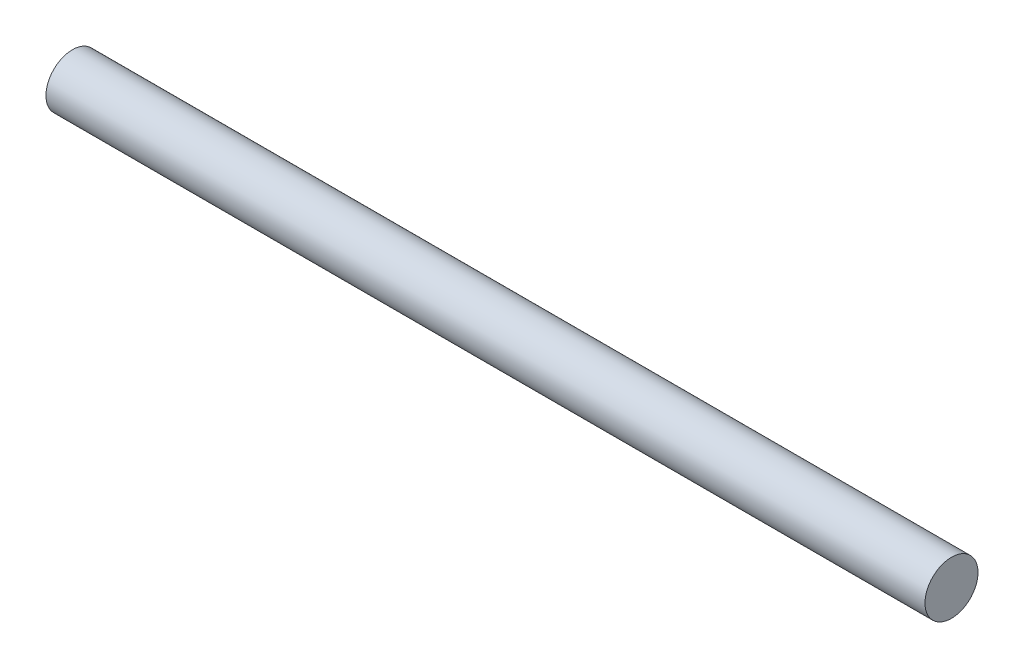
ISO-10303-21;
HEADER;
FILE_DESCRIPTION(('STEP AP214'),'2;1');
FILE_NAME('part.step','',(''),(''),'','','');
FILE_SCHEMA(('AUTOMOTIVE_DESIGN { 1 0 10303 214 1 1 1 1 }'));
ENDSEC;
DATA;
#1=APPLICATION_CONTEXT('core data for automotive mechanical design processes');
#2=APPLICATION_PROTOCOL_DEFINITION('international standard','automotive_design',2000,#1);
#3=PRODUCT_CONTEXT('',#1,'mechanical');
#4=PRODUCT('Part','Part','',(#3));
#5=PRODUCT_RELATED_PRODUCT_CATEGORY('part','',(#4));
#6=PRODUCT_DEFINITION_FORMATION('','',#4);
#7=PRODUCT_DEFINITION_CONTEXT('part definition',#1,'design');
#8=PRODUCT_DEFINITION('design','',#6,#7);
#9=PRODUCT_DEFINITION_SHAPE('','',#8);
#10=(LENGTH_UNIT() NAMED_UNIT(*) SI_UNIT(.MILLI.,.METRE.));
#11=(NAMED_UNIT(*) PLANE_ANGLE_UNIT() SI_UNIT($,.RADIAN.));
#12=(NAMED_UNIT(*) SI_UNIT($,.STERADIAN.) SOLID_ANGLE_UNIT());
#13=UNCERTAINTY_MEASURE_WITH_UNIT(LENGTH_MEASURE(1.E-05),#10,'distance_accuracy_value','');
#14=(GEOMETRIC_REPRESENTATION_CONTEXT(3) GLOBAL_UNCERTAINTY_ASSIGNED_CONTEXT((#13)) GLOBAL_UNIT_ASSIGNED_CONTEXT((#10,
#11,#12)) REPRESENTATION_CONTEXT('',''));
#15=CARTESIAN_POINT('',(0.,0.,0.));
#16=DIRECTION('',(0.,0.,1.));
#17=DIRECTION('',(1.,0.,0.));
#18=AXIS2_PLACEMENT_3D('',#15,#16,#17);
#19=CARTESIAN_POINT('',(80.,0.,0.));
#20=DIRECTION('',(-1.,0.,0.));
#21=DIRECTION('',(0.,0.,1.));
#22=AXIS2_PLACEMENT_3D('',#19,#20,#21);
#23=CYLINDRICAL_SURFACE('',#22,2.413);
#24=CARTESIAN_POINT('',(80.,0.,0.));
#25=DIRECTION('',(1.,0.,0.));
#26=DIRECTION('',(0.,0.,-1.));
#27=AXIS2_PLACEMENT_3D('',#24,#25,#26);
#28=CIRCLE('',#27,2.413);
#29=CARTESIAN_POINT('',(80.,0.,-2.413));
#30=VERTEX_POINT('',#29);
#31=EDGE_CURVE('E10',#30,#30,#28,.T.);
#32=ORIENTED_EDGE('',*,*,#31,.F.);
#33=EDGE_LOOP('',(#32));
#34=FACE_BOUND('',#33,.T.);
#35=CARTESIAN_POINT('',(0.,0.,0.));
#36=DIRECTION('',(1.,0.,0.));
#37=DIRECTION('',(0.,0.,-1.));
#38=AXIS2_PLACEMENT_3D('',#35,#36,#37);
#39=CIRCLE('',#38,2.413);
#40=CARTESIAN_POINT('',(0.,0.,-2.413));
#41=VERTEX_POINT('',#40);
#42=EDGE_CURVE('E35',#41,#41,#39,.T.);
#43=ORIENTED_EDGE('',*,*,#42,.T.);
#44=EDGE_LOOP('',(#43));
#45=FACE_BOUND('',#44,.T.);
#46=ADVANCED_FACE('F32',(#34,#45),#23,.T.);
#47=CARTESIAN_POINT('',(80.,0.,0.));
#48=DIRECTION('',(1.,0.,0.));
#49=DIRECTION('',(0.,0.,-1.));
#50=AXIS2_PLACEMENT_3D('',#47,#48,#49);
#51=PLANE('',#50);
#52=ORIENTED_EDGE('',*,*,#31,.T.);
#53=EDGE_LOOP('',(#52));
#54=FACE_BOUND('',#53,.T.);
#55=ADVANCED_FACE('F47',(#54),#51,.T.);
#56=CARTESIAN_POINT('',(0.,0.,0.));
#57=DIRECTION('',(1.,0.,0.));
#58=DIRECTION('',(0.,0.,-1.));
#59=AXIS2_PLACEMENT_3D('',#56,#57,#58);
#60=PLANE('',#59);
#61=ORIENTED_EDGE('',*,*,#42,.F.);
#62=EDGE_LOOP('',(#61));
#63=FACE_BOUND('',#62,.T.);
#64=ADVANCED_FACE('F45',(#63),#60,.F.);
#65=CLOSED_SHELL('',(#46,#55,#64));
#66=MANIFOLD_SOLID_BREP('B2',#65);
#67=ADVANCED_BREP_SHAPE_REPRESENTATION('',(#18,#66),#14);
#68=SHAPE_DEFINITION_REPRESENTATION(#9,#67);
ENDSEC;
END-ISO-10303-21;
